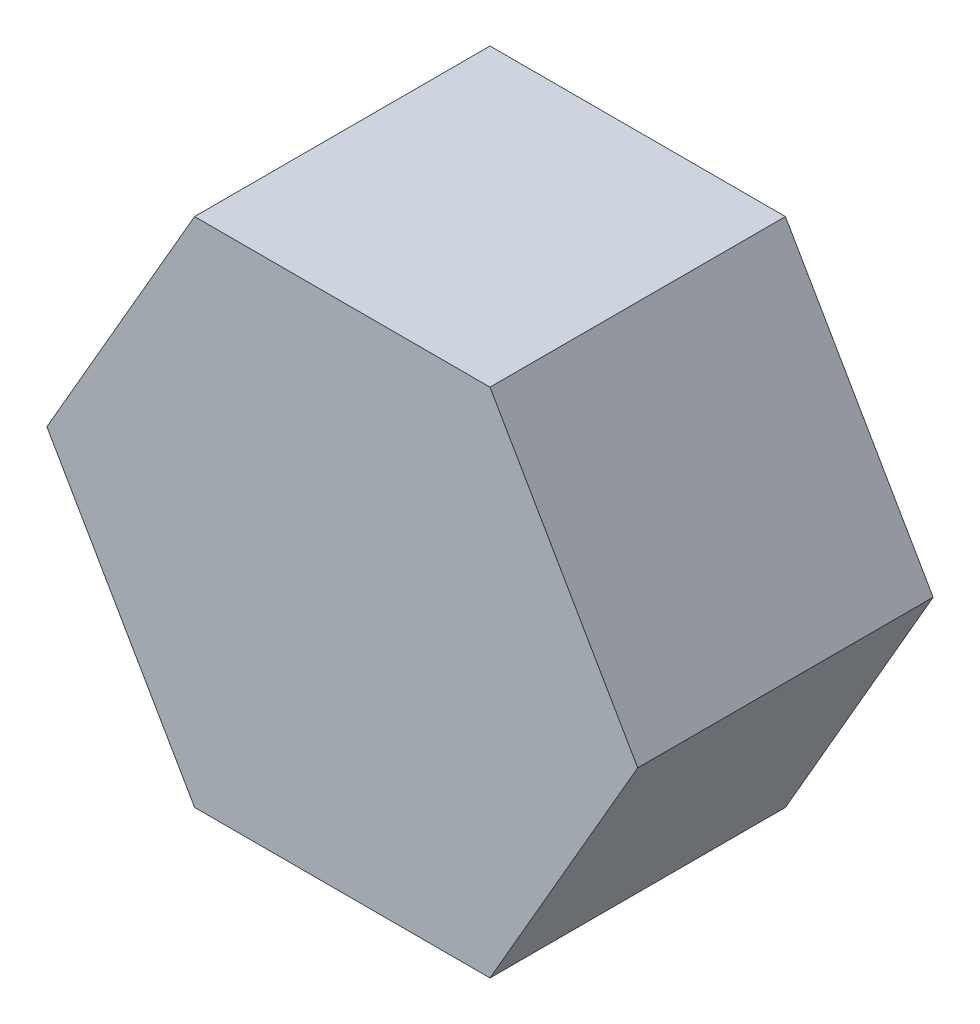
ISO-10303-21;
HEADER;
FILE_DESCRIPTION(('STEP AP214'),'2;1');
FILE_NAME('part.step','',(''),(''),'','','');
FILE_SCHEMA(('AUTOMOTIVE_DESIGN { 1 0 10303 214 1 1 1 1 }'));
ENDSEC;
DATA;
#1=APPLICATION_CONTEXT('core data for automotive mechanical design processes');
#2=APPLICATION_PROTOCOL_DEFINITION('international standard','automotive_design',2000,#1);
#3=PRODUCT_CONTEXT('',#1,'mechanical');
#4=PRODUCT('Part','Part','',(#3));
#5=PRODUCT_RELATED_PRODUCT_CATEGORY('part','',(#4));
#6=PRODUCT_DEFINITION_FORMATION('','',#4);
#7=PRODUCT_DEFINITION_CONTEXT('part definition',#1,'design');
#8=PRODUCT_DEFINITION('design','',#6,#7);
#9=PRODUCT_DEFINITION_SHAPE('','',#8);
#10=(LENGTH_UNIT() NAMED_UNIT(*) SI_UNIT(.MILLI.,.METRE.));
#11=(NAMED_UNIT(*) PLANE_ANGLE_UNIT() SI_UNIT($,.RADIAN.));
#12=(NAMED_UNIT(*) SI_UNIT($,.STERADIAN.) SOLID_ANGLE_UNIT());
#13=UNCERTAINTY_MEASURE_WITH_UNIT(LENGTH_MEASURE(1.E-05),#10,'distance_accuracy_value','');
#14=(GEOMETRIC_REPRESENTATION_CONTEXT(3) GLOBAL_UNCERTAINTY_ASSIGNED_CONTEXT((#13)) GLOBAL_UNIT_ASSIGNED_CONTEXT((#10,
#11,#12)) REPRESENTATION_CONTEXT('',''));
#15=CARTESIAN_POINT('',(0.,0.,0.));
#16=DIRECTION('',(0.,0.,1.));
#17=DIRECTION('',(1.,0.,0.));
#18=AXIS2_PLACEMENT_3D('',#15,#16,#17);
#19=CARTESIAN_POINT('',(0.,0.,25.));
#20=DIRECTION('',(0.866025403784436,-0.500000000000004,0.));
#21=DIRECTION('',(0.500000000000004,0.866025403784436,0.));
#22=AXIS2_PLACEMENT_3D('',#19,#20,#21);
#23=PLANE('',#22);
#24=DIRECTION('',(-0.500000000000004,-0.866025403784436,0.));
#25=VECTOR('',#24,1.);
#26=CARTESIAN_POINT('',(0.,0.,0.));
#27=LINE('',#26,#25);
#28=CARTESIAN_POINT('',(0.,0.,0.));
#29=VERTEX_POINT('',#28);
#30=CARTESIAN_POINT('',(-12.5000000000001,-21.6506350946109,0.));
#31=VERTEX_POINT('',#30);
#32=EDGE_CURVE('E117',#29,#31,#27,.T.);
#33=ORIENTED_EDGE('',*,*,#32,.T.);
#34=DIRECTION('',(0.,0.,-1.));
#35=VECTOR('',#34,1.);
#36=CARTESIAN_POINT('',(-12.5000000000001,-21.6506350946109,25.));
#37=LINE('',#36,#35);
#38=CARTESIAN_POINT('',(-12.5000000000001,-21.6506350946109,25.));
#39=VERTEX_POINT('',#38);
#40=EDGE_CURVE('E11',#39,#31,#37,.T.);
#41=ORIENTED_EDGE('',*,*,#40,.F.);
#42=DIRECTION('',(-0.500000000000004,-0.866025403784436,0.));
#43=VECTOR('',#42,1.);
#44=CARTESIAN_POINT('',(0.,0.,25.));
#45=LINE('',#44,#43);
#46=CARTESIAN_POINT('',(0.,0.,25.));
#47=VERTEX_POINT('',#46);
#48=EDGE_CURVE('E127',#47,#39,#45,.T.);
#49=ORIENTED_EDGE('',*,*,#48,.F.);
#50=DIRECTION('',(0.,0.,-1.));
#51=VECTOR('',#50,1.);
#52=CARTESIAN_POINT('',(0.,0.,25.));
#53=LINE('',#52,#51);
#54=EDGE_CURVE('E113',#47,#29,#53,.T.);
#55=ORIENTED_EDGE('',*,*,#54,.T.);
#56=EDGE_LOOP('',(#33,#41,#49,#55));
#57=FACE_BOUND('',#56,.T.);
#58=ADVANCED_FACE('F33',(#57),#23,.F.);
#59=CARTESIAN_POINT('',(-12.5000000000001,-21.6506350946109,25.));
#60=DIRECTION('',(0.866025403784439,0.5,0.));
#61=DIRECTION('',(-0.5,0.866025403784439,0.));
#62=AXIS2_PLACEMENT_3D('',#59,#60,#61);
#63=PLANE('',#62);
#64=DIRECTION('',(0.5,-0.866025403784439,0.));
#65=VECTOR('',#64,1.);
#66=CARTESIAN_POINT('',(-12.5000000000001,-21.6506350946109,0.));
#67=LINE('',#66,#65);
#68=CARTESIAN_POINT('',(-1.08203376814053E-13,-43.3012701892219,0.));
#69=VERTEX_POINT('',#68);
#70=EDGE_CURVE('E120',#31,#69,#67,.T.);
#71=ORIENTED_EDGE('',*,*,#70,.T.);
#72=DIRECTION('',(0.,0.,-1.));
#73=VECTOR('',#72,1.);
#74=CARTESIAN_POINT('',(-1.08203376814053E-13,-43.3012701892219,25.));
#75=LINE('',#74,#73);
#76=CARTESIAN_POINT('',(-1.08203376814053E-13,-43.3012701892219,25.));
#77=VERTEX_POINT('',#76);
#78=EDGE_CURVE('E41',#77,#69,#75,.T.);
#79=ORIENTED_EDGE('',*,*,#78,.F.);
#80=DIRECTION('',(0.5,-0.866025403784439,0.));
#81=VECTOR('',#80,1.);
#82=CARTESIAN_POINT('',(-12.5000000000001,-21.6506350946109,25.));
#83=LINE('',#82,#81);
#84=EDGE_CURVE('E86',#39,#77,#83,.T.);
#85=ORIENTED_EDGE('',*,*,#84,.F.);
#86=ORIENTED_EDGE('',*,*,#40,.T.);
#87=EDGE_LOOP('',(#71,#79,#85,#86));
#88=FACE_BOUND('',#87,.T.);
#89=ADVANCED_FACE('F151',(#88),#63,.F.);
#90=CARTESIAN_POINT('',(-1.08203376814053E-13,-43.3012701892219,25.));
#91=DIRECTION('',(0.,1.,0.));
#92=DIRECTION('',(0.,0.,1.));
#93=AXIS2_PLACEMENT_3D('',#90,#91,#92);
#94=PLANE('',#93);
#95=DIRECTION('',(1.,0.,0.));
#96=VECTOR('',#95,1.);
#97=CARTESIAN_POINT('',(-1.08203376814053E-13,-43.3012701892219,0.));
#98=LINE('',#97,#96);
#99=CARTESIAN_POINT('',(24.9999999999999,-43.3012701892219,0.));
#100=VERTEX_POINT('',#99);
#101=EDGE_CURVE('E122',#69,#100,#98,.T.);
#102=ORIENTED_EDGE('',*,*,#101,.T.);
#103=DIRECTION('',(0.,0.,-1.));
#104=VECTOR('',#103,1.);
#105=CARTESIAN_POINT('',(24.9999999999999,-43.3012701892219,25.));
#106=LINE('',#105,#104);
#107=CARTESIAN_POINT('',(24.9999999999999,-43.3012701892219,25.));
#108=VERTEX_POINT('',#107);
#109=EDGE_CURVE('E108',#108,#100,#106,.T.);
#110=ORIENTED_EDGE('',*,*,#109,.F.);
#111=DIRECTION('',(1.,0.,0.));
#112=VECTOR('',#111,1.);
#113=CARTESIAN_POINT('',(-1.08203376814053E-13,-43.3012701892219,25.));
#114=LINE('',#113,#112);
#115=EDGE_CURVE('E99',#77,#108,#114,.T.);
#116=ORIENTED_EDGE('',*,*,#115,.F.);
#117=ORIENTED_EDGE('',*,*,#78,.T.);
#118=EDGE_LOOP('',(#102,#110,#116,#117));
#119=FACE_BOUND('',#118,.T.);
#120=ADVANCED_FACE('F133',(#119),#94,.F.);
#121=CARTESIAN_POINT('',(37.5,-21.650635094611,25.));
#122=DIRECTION('',(-0.866025403784437,0.500000000000003,0.));
#123=DIRECTION('',(-0.500000000000003,-0.866025403784437,0.));
#124=AXIS2_PLACEMENT_3D('',#121,#122,#123);
#125=PLANE('',#124);
#126=DIRECTION('',(0.500000000000003,0.866025403784437,0.));
#127=VECTOR('',#126,1.);
#128=CARTESIAN_POINT('',(37.5,-21.650635094611,0.));
#129=LINE('',#128,#127);
#130=CARTESIAN_POINT('',(37.5,-21.650635094611,0.));
#131=VERTEX_POINT('',#130);
#132=EDGE_CURVE('E107',#100,#131,#129,.T.);
#133=ORIENTED_EDGE('',*,*,#132,.T.);
#134=DIRECTION('',(0.,0.,-1.));
#135=VECTOR('',#134,1.);
#136=CARTESIAN_POINT('',(37.5,-21.650635094611,25.));
#137=LINE('',#136,#135);
#138=CARTESIAN_POINT('',(37.5,-21.650635094611,25.));
#139=VERTEX_POINT('',#138);
#140=EDGE_CURVE('E104',#139,#131,#137,.T.);
#141=ORIENTED_EDGE('',*,*,#140,.F.);
#142=DIRECTION('',(0.500000000000003,0.866025403784437,0.));
#143=VECTOR('',#142,1.);
#144=CARTESIAN_POINT('',(37.5,-21.650635094611,25.));
#145=LINE('',#144,#143);
#146=EDGE_CURVE('E93',#108,#139,#145,.T.);
#147=ORIENTED_EDGE('',*,*,#146,.F.);
#148=ORIENTED_EDGE('',*,*,#109,.T.);
#149=EDGE_LOOP('',(#133,#141,#147,#148));
#150=FACE_BOUND('',#149,.T.);
#151=ADVANCED_FACE('F105',(#150),#125,.F.);
#152=CARTESIAN_POINT('',(25.,0.,25.));
#153=DIRECTION('',(-0.86602540378444,-0.499999999999998,0.));
#154=DIRECTION('',(0.499999999999998,-0.86602540378444,0.));
#155=AXIS2_PLACEMENT_3D('',#152,#153,#154);
#156=PLANE('',#155);
#157=DIRECTION('',(-0.499999999999998,0.86602540378444,0.));
#158=VECTOR('',#157,1.);
#159=CARTESIAN_POINT('',(25.,0.,0.));
#160=LINE('',#159,#158);
#161=CARTESIAN_POINT('',(25.,0.,0.));
#162=VERTEX_POINT('',#161);
#163=EDGE_CURVE('E72',#131,#162,#160,.T.);
#164=ORIENTED_EDGE('',*,*,#163,.T.);
#165=DIRECTION('',(0.,0.,-1.));
#166=VECTOR('',#165,1.);
#167=CARTESIAN_POINT('',(25.,0.,25.));
#168=LINE('',#167,#166);
#169=CARTESIAN_POINT('',(25.,0.,25.));
#170=VERTEX_POINT('',#169);
#171=EDGE_CURVE('E109',#170,#162,#168,.T.);
#172=ORIENTED_EDGE('',*,*,#171,.F.);
#173=DIRECTION('',(-0.499999999999998,0.86602540378444,0.));
#174=VECTOR('',#173,1.);
#175=CARTESIAN_POINT('',(25.,0.,25.));
#176=LINE('',#175,#174);
#177=EDGE_CURVE('E97',#139,#170,#176,.T.);
#178=ORIENTED_EDGE('',*,*,#177,.F.);
#179=ORIENTED_EDGE('',*,*,#140,.T.);
#180=EDGE_LOOP('',(#164,#172,#178,#179));
#181=FACE_BOUND('',#180,.T.);
#182=ADVANCED_FACE('F111',(#181),#156,.F.);
#183=CARTESIAN_POINT('',(0.,0.,25.));
#184=DIRECTION('',(0.,-1.,0.));
#185=DIRECTION('',(0.,0.,-1.));
#186=AXIS2_PLACEMENT_3D('',#183,#184,#185);
#187=PLANE('',#186);
#188=DIRECTION('',(-1.,0.,0.));
#189=VECTOR('',#188,1.);
#190=CARTESIAN_POINT('',(0.,0.,0.));
#191=LINE('',#190,#189);
#192=EDGE_CURVE('E78',#162,#29,#191,.T.);
#193=ORIENTED_EDGE('',*,*,#192,.T.);
#194=ORIENTED_EDGE('',*,*,#54,.F.);
#195=DIRECTION('',(-1.,0.,0.));
#196=VECTOR('',#195,1.);
#197=CARTESIAN_POINT('',(0.,0.,25.));
#198=LINE('',#197,#196);
#199=EDGE_CURVE('E49',#170,#47,#198,.T.);
#200=ORIENTED_EDGE('',*,*,#199,.F.);
#201=ORIENTED_EDGE('',*,*,#171,.T.);
#202=EDGE_LOOP('',(#193,#194,#200,#201));
#203=FACE_BOUND('',#202,.T.);
#204=ADVANCED_FACE('F140',(#203),#187,.F.);
#205=CARTESIAN_POINT('',(0.,0.,25.));
#206=DIRECTION('',(0.,0.,1.));
#207=DIRECTION('',(1.,0.,0.));
#208=AXIS2_PLACEMENT_3D('',#205,#206,#207);
#209=PLANE('',#208);
#210=ORIENTED_EDGE('',*,*,#48,.T.);
#211=ORIENTED_EDGE('',*,*,#84,.T.);
#212=ORIENTED_EDGE('',*,*,#115,.T.);
#213=ORIENTED_EDGE('',*,*,#146,.T.);
#214=ORIENTED_EDGE('',*,*,#177,.T.);
#215=ORIENTED_EDGE('',*,*,#199,.T.);
#216=EDGE_LOOP('',(#210,#211,#212,#213,#214,#215));
#217=FACE_BOUND('',#216,.T.);
#218=ADVANCED_FACE('F95',(#217),#209,.T.);
#219=CARTESIAN_POINT('',(0.,0.,0.));
#220=DIRECTION('',(0.,0.,1.));
#221=DIRECTION('',(1.,0.,0.));
#222=AXIS2_PLACEMENT_3D('',#219,#220,#221);
#223=PLANE('',#222);
#224=ORIENTED_EDGE('',*,*,#32,.F.);
#225=ORIENTED_EDGE('',*,*,#192,.F.);
#226=ORIENTED_EDGE('',*,*,#163,.F.);
#227=ORIENTED_EDGE('',*,*,#132,.F.);
#228=ORIENTED_EDGE('',*,*,#101,.F.);
#229=ORIENTED_EDGE('',*,*,#70,.F.);
#230=EDGE_LOOP('',(#224,#225,#226,#227,#228,#229));
#231=FACE_BOUND('',#230,.T.);
#232=ADVANCED_FACE('F136',(#231),#223,.F.);
#233=CLOSED_SHELL('',(#58,#89,#120,#151,#182,#204,#218,#232));
#234=MANIFOLD_SOLID_BREP('B2',#233);
#235=ADVANCED_BREP_SHAPE_REPRESENTATION('',(#18,#234),#14);
#236=SHAPE_DEFINITION_REPRESENTATION(#9,#235);
ENDSEC;
END-ISO-10303-21;
